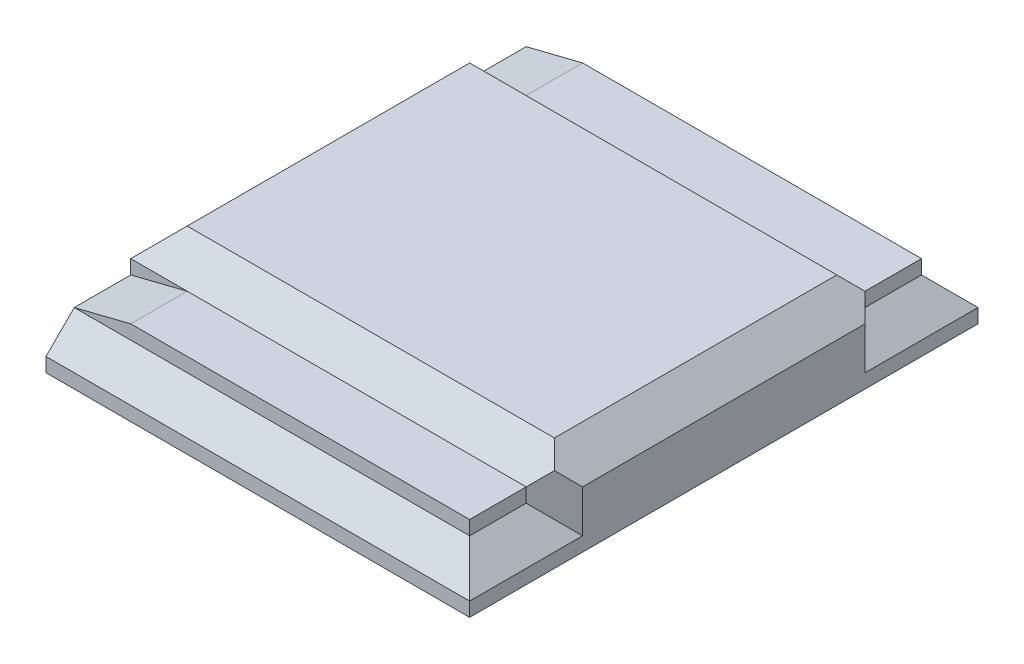
ISO-10303-21;
HEADER;
FILE_DESCRIPTION(('STEP AP214'),'2;1');
FILE_NAME('part.step','',(''),(''),'','','');
FILE_SCHEMA(('AUTOMOTIVE_DESIGN { 1 0 10303 214 1 1 1 1 }'));
ENDSEC;
DATA;
#1=APPLICATION_CONTEXT('core data for automotive mechanical design processes');
#2=APPLICATION_PROTOCOL_DEFINITION('international standard','automotive_design',2000,#1);
#3=PRODUCT_CONTEXT('',#1,'mechanical');
#4=PRODUCT('Part','Part','',(#3));
#5=PRODUCT_RELATED_PRODUCT_CATEGORY('part','',(#4));
#6=PRODUCT_DEFINITION_FORMATION('','',#4);
#7=PRODUCT_DEFINITION_CONTEXT('part definition',#1,'design');
#8=PRODUCT_DEFINITION('design','',#6,#7);
#9=PRODUCT_DEFINITION_SHAPE('','',#8);
#10=(LENGTH_UNIT() NAMED_UNIT(*) SI_UNIT(.MILLI.,.METRE.));
#11=(NAMED_UNIT(*) PLANE_ANGLE_UNIT() SI_UNIT($,.RADIAN.));
#12=(NAMED_UNIT(*) SI_UNIT($,.STERADIAN.) SOLID_ANGLE_UNIT());
#13=UNCERTAINTY_MEASURE_WITH_UNIT(LENGTH_MEASURE(1.E-05),#10,'distance_accuracy_value','');
#14=(GEOMETRIC_REPRESENTATION_CONTEXT(3) GLOBAL_UNCERTAINTY_ASSIGNED_CONTEXT((#13)) GLOBAL_UNIT_ASSIGNED_CONTEXT((#10,
#11,#12)) REPRESENTATION_CONTEXT('',''));
#15=CARTESIAN_POINT('',(0.,0.,0.));
#16=DIRECTION('',(0.,0.,1.));
#17=DIRECTION('',(1.,0.,0.));
#18=AXIS2_PLACEMENT_3D('',#15,#16,#17);
#19=CARTESIAN_POINT('',(9.,3.,6.));
#20=DIRECTION('',(0.,0.,-1.));
#21=DIRECTION('',(-1.,0.,0.));
#22=AXIS2_PLACEMENT_3D('',#19,#20,#21);
#23=PLANE('',#22);
#24=DIRECTION('',(-0.970142500145332,-0.242535625036331,0.));
#25=VECTOR('',#24,1.);
#26=CARTESIAN_POINT('',(-6.,1.5,6.));
#27=LINE('',#26,#25);
#28=CARTESIAN_POINT('',(-4.,2.,6.));
#29=VERTEX_POINT('',#28);
#30=CARTESIAN_POINT('',(-6.,1.5,6.));
#31=VERTEX_POINT('',#30);
#32=EDGE_CURVE('E181',#29,#31,#27,.T.);
#33=ORIENTED_EDGE('',*,*,#32,.F.);
#34=DIRECTION('',(-1.,0.,0.));
#35=VECTOR('',#34,1.);
#36=CARTESIAN_POINT('',(-9.,2.,6.));
#37=LINE('',#36,#35);
#38=CARTESIAN_POINT('',(-6.,2.,6.));
#39=VERTEX_POINT('',#38);
#40=EDGE_CURVE('E284',#29,#39,#37,.T.);
#41=ORIENTED_EDGE('',*,*,#40,.T.);
#42=DIRECTION('',(0.,1.,0.));
#43=VECTOR('',#42,1.);
#44=CARTESIAN_POINT('',(-6.,2.,6.));
#45=LINE('',#44,#43);
#46=EDGE_CURVE('E269',#31,#39,#45,.T.);
#47=ORIENTED_EDGE('',*,*,#46,.F.);
#48=EDGE_LOOP('',(#33,#41,#47));
#49=FACE_BOUND('',#48,.T.);
#50=ADVANCED_FACE('F43',(#49),#23,.F.);
#51=CARTESIAN_POINT('',(9.,3.,-6.));
#52=DIRECTION('',(0.,0.,1.));
#53=DIRECTION('',(1.,0.,0.));
#54=AXIS2_PLACEMENT_3D('',#51,#52,#53);
#55=PLANE('',#54);
#56=DIRECTION('',(0.970142500145332,0.242535625036332,0.));
#57=VECTOR('',#56,1.);
#58=CARTESIAN_POINT('',(-6.,1.5,-6.));
#59=LINE('',#58,#57);
#60=CARTESIAN_POINT('',(-6.,1.5,-6.));
#61=VERTEX_POINT('',#60);
#62=CARTESIAN_POINT('',(-4.,2.,-6.));
#63=VERTEX_POINT('',#62);
#64=EDGE_CURVE('E277',#61,#63,#59,.T.);
#65=ORIENTED_EDGE('',*,*,#64,.F.);
#66=DIRECTION('',(0.,-1.,0.));
#67=VECTOR('',#66,1.);
#68=CARTESIAN_POINT('',(-6.,1.5,-6.));
#69=LINE('',#68,#67);
#70=CARTESIAN_POINT('',(-6.,2.,-6.));
#71=VERTEX_POINT('',#70);
#72=EDGE_CURVE('E242',#71,#61,#69,.T.);
#73=ORIENTED_EDGE('',*,*,#72,.F.);
#74=DIRECTION('',(1.,0.,0.));
#75=VECTOR('',#74,1.);
#76=CARTESIAN_POINT('',(9.,2.,-6.));
#77=LINE('',#76,#75);
#78=EDGE_CURVE('E276',#71,#63,#77,.T.);
#79=ORIENTED_EDGE('',*,*,#78,.T.);
#80=EDGE_LOOP('',(#65,#73,#79));
#81=FACE_BOUND('',#80,.T.);
#82=ADVANCED_FACE('F275',(#81),#55,.F.);
#83=CARTESIAN_POINT('',(-9.,1.5,-9.));
#84=DIRECTION('',(0.,0.,1.));
#85=DIRECTION('',(1.,0.,0.));
#86=AXIS2_PLACEMENT_3D('',#83,#84,#85);
#87=PLANE('',#86);
#88=DIRECTION('',(0.,-1.,0.));
#89=VECTOR('',#88,1.);
#90=CARTESIAN_POINT('',(-6.,0.499999999999996,-9.));
#91=LINE('',#90,#89);
#92=CARTESIAN_POINT('',(-6.,0.499999999999996,-9.));
#93=VERTEX_POINT('',#92);
#94=CARTESIAN_POINT('',(-6.,0.,-9.));
#95=VERTEX_POINT('',#94);
#96=EDGE_CURVE('E394',#93,#95,#91,.T.);
#97=ORIENTED_EDGE('',*,*,#96,.F.);
#98=DIRECTION('',(1.,0.,0.));
#99=VECTOR('',#98,1.);
#100=CARTESIAN_POINT('',(-9.,0.499999999999996,-9.));
#101=LINE('',#100,#99);
#102=CARTESIAN_POINT('',(9.,0.499999999999996,-9.));
#103=VERTEX_POINT('',#102);
#104=EDGE_CURVE('E358',#93,#103,#101,.T.);
#105=ORIENTED_EDGE('',*,*,#104,.T.);
#106=DIRECTION('',(0.,-1.,0.));
#107=VECTOR('',#106,1.);
#108=CARTESIAN_POINT('',(9.,1.5,-9.));
#109=LINE('',#108,#107);
#110=CARTESIAN_POINT('',(9.,0.,-9.));
#111=VERTEX_POINT('',#110);
#112=EDGE_CURVE('E194',#103,#111,#109,.T.);
#113=ORIENTED_EDGE('',*,*,#112,.T.);
#114=DIRECTION('',(-1.,0.,0.));
#115=VECTOR('',#114,1.);
#116=CARTESIAN_POINT('',(-9.,0.,-9.));
#117=LINE('',#116,#115);
#118=EDGE_CURVE('E381',#111,#95,#117,.T.);
#119=ORIENTED_EDGE('',*,*,#118,.T.);
#120=EDGE_LOOP('',(#97,#105,#113,#119));
#121=FACE_BOUND('',#120,.T.);
#122=ADVANCED_FACE('F451',(#121),#87,.F.);
#123=CARTESIAN_POINT('',(-9.,1.5,9.));
#124=DIRECTION('',(0.,0.,-1.));
#125=DIRECTION('',(-1.,0.,0.));
#126=AXIS2_PLACEMENT_3D('',#123,#124,#125);
#127=PLANE('',#126);
#128=DIRECTION('',(0.,1.,0.));
#129=VECTOR('',#128,1.);
#130=CARTESIAN_POINT('',(-6.,0.,9.));
#131=LINE('',#130,#129);
#132=CARTESIAN_POINT('',(-6.,0.,9.));
#133=VERTEX_POINT('',#132);
#134=CARTESIAN_POINT('',(-6.,0.499999999999996,9.));
#135=VERTEX_POINT('',#134);
#136=EDGE_CURVE('E370',#133,#135,#131,.T.);
#137=ORIENTED_EDGE('',*,*,#136,.F.);
#138=DIRECTION('',(1.,0.,0.));
#139=VECTOR('',#138,1.);
#140=CARTESIAN_POINT('',(-9.,0.,9.));
#141=LINE('',#140,#139);
#142=CARTESIAN_POINT('',(9.,0.,9.));
#143=VERTEX_POINT('',#142);
#144=EDGE_CURVE('E374',#133,#143,#141,.T.);
#145=ORIENTED_EDGE('',*,*,#144,.T.);
#146=DIRECTION('',(0.,-1.,0.));
#147=VECTOR('',#146,1.);
#148=CARTESIAN_POINT('',(9.,1.5,9.));
#149=LINE('',#148,#147);
#150=CARTESIAN_POINT('',(9.,0.499999999999996,9.));
#151=VERTEX_POINT('',#150);
#152=EDGE_CURVE('E373',#151,#143,#149,.T.);
#153=ORIENTED_EDGE('',*,*,#152,.F.);
#154=DIRECTION('',(-1.,0.,0.));
#155=VECTOR('',#154,1.);
#156=CARTESIAN_POINT('',(-9.,0.499999999999996,9.));
#157=LINE('',#156,#155);
#158=EDGE_CURVE('E201',#151,#135,#157,.T.);
#159=ORIENTED_EDGE('',*,*,#158,.T.);
#160=EDGE_LOOP('',(#137,#145,#153,#159));
#161=FACE_BOUND('',#160,.T.);
#162=ADVANCED_FACE('F369',(#161),#127,.F.);
#163=CARTESIAN_POINT('',(0.,0.,0.));
#164=DIRECTION('',(0.,-1.,0.));
#165=DIRECTION('',(0.,0.,-1.));
#166=AXIS2_PLACEMENT_3D('',#163,#164,#165);
#167=PLANE('',#166);
#168=ORIENTED_EDGE('',*,*,#144,.F.);
#169=DIRECTION('',(0.,0.,1.));
#170=VECTOR('',#169,1.);
#171=CARTESIAN_POINT('',(-6.,0.,-9.));
#172=LINE('',#171,#170);
#173=EDGE_CURVE('E391',#95,#133,#172,.T.);
#174=ORIENTED_EDGE('',*,*,#173,.F.);
#175=ORIENTED_EDGE('',*,*,#118,.F.);
#176=DIRECTION('',(0.,0.,-1.));
#177=VECTOR('',#176,1.);
#178=CARTESIAN_POINT('',(9.,0.,9.));
#179=LINE('',#178,#177);
#180=EDGE_CURVE('E254',#143,#111,#179,.T.);
#181=ORIENTED_EDGE('',*,*,#180,.F.);
#182=EDGE_LOOP('',(#168,#174,#175,#181));
#183=FACE_BOUND('',#182,.T.);
#184=ADVANCED_FACE('F449',(#183),#167,.T.);
#185=CARTESIAN_POINT('',(0.,1.5,-8.));
#186=DIRECTION('',(0.,-0.707106781186546,0.707106781186549));
#187=DIRECTION('',(-1.,0.,0.));
#188=AXIS2_PLACEMENT_3D('',#185,#186,#187);
#189=PLANE('',#188);
#190=ORIENTED_EDGE('',*,*,#104,.F.);
#191=DIRECTION('',(0.,-0.707106781186549,-0.707106781186546));
#192=VECTOR('',#191,1.);
#193=CARTESIAN_POINT('',(-6.,1.5,-8.));
#194=LINE('',#193,#192);
#195=CARTESIAN_POINT('',(-6.,1.5,-8.));
#196=VERTEX_POINT('',#195);
#197=EDGE_CURVE('E354',#196,#93,#194,.T.);
#198=ORIENTED_EDGE('',*,*,#197,.F.);
#199=DIRECTION('',(-1.,0.,0.));
#200=VECTOR('',#199,1.);
#201=CARTESIAN_POINT('',(0.,1.5,-8.));
#202=LINE('',#201,#200);
#203=CARTESIAN_POINT('',(8.,1.5,-8.));
#204=VERTEX_POINT('',#203);
#205=EDGE_CURVE('E193',#204,#196,#202,.T.);
#206=ORIENTED_EDGE('',*,*,#205,.F.);
#207=DIRECTION('',(0.577350269189625,-0.577350269189627,-0.577350269189625));
#208=VECTOR('',#207,1.);
#209=CARTESIAN_POINT('',(5.33333333333334,4.16666666666667,-5.33333333333334));
#210=LINE('',#209,#208);
#211=EDGE_CURVE('E231',#204,#103,#210,.T.);
#212=ORIENTED_EDGE('',*,*,#211,.T.);
#213=EDGE_LOOP('',(#190,#198,#206,#212));
#214=FACE_BOUND('',#213,.T.);
#215=ADVANCED_FACE('F353',(#214),#189,.F.);
#216=CARTESIAN_POINT('',(0.,1.5,8.));
#217=DIRECTION('',(0.,-0.707106781186546,-0.707106781186549));
#218=DIRECTION('',(1.,0.,0.));
#219=AXIS2_PLACEMENT_3D('',#216,#217,#218);
#220=PLANE('',#219);
#221=DIRECTION('',(1.,0.,0.));
#222=VECTOR('',#221,1.);
#223=CARTESIAN_POINT('',(0.,1.5,8.));
#224=LINE('',#223,#222);
#225=CARTESIAN_POINT('',(-6.,1.5,8.));
#226=VERTEX_POINT('',#225);
#227=CARTESIAN_POINT('',(8.,1.5,8.));
#228=VERTEX_POINT('',#227);
#229=EDGE_CURVE('E184',#226,#228,#224,.T.);
#230=ORIENTED_EDGE('',*,*,#229,.F.);
#231=DIRECTION('',(0.,0.707106781186549,-0.707106781186546));
#232=VECTOR('',#231,1.);
#233=CARTESIAN_POINT('',(-6.,0.499999999999996,9.));
#234=LINE('',#233,#232);
#235=EDGE_CURVE('E403',#135,#226,#234,.T.);
#236=ORIENTED_EDGE('',*,*,#235,.F.);
#237=ORIENTED_EDGE('',*,*,#158,.F.);
#238=DIRECTION('',(-0.577350269189625,0.577350269189627,-0.577350269189625));
#239=VECTOR('',#238,1.);
#240=CARTESIAN_POINT('',(5.33333333333334,4.16666666666667,5.33333333333334));
#241=LINE('',#240,#239);
#242=EDGE_CURVE('E198',#151,#228,#241,.T.);
#243=ORIENTED_EDGE('',*,*,#242,.T.);
#244=EDGE_LOOP('',(#230,#236,#237,#243));
#245=FACE_BOUND('',#244,.T.);
#246=ADVANCED_FACE('F199',(#245),#220,.F.);
#247=CARTESIAN_POINT('',(9.,1.5,9.));
#248=DIRECTION('',(-1.,0.,0.));
#249=DIRECTION('',(0.,0.,1.));
#250=AXIS2_PLACEMENT_3D('',#247,#248,#249);
#251=PLANE('',#250);
#252=DIRECTION('',(0.,-1.,0.));
#253=VECTOR('',#252,1.);
#254=CARTESIAN_POINT('',(9.,1.5,5.));
#255=LINE('',#254,#253);
#256=CARTESIAN_POINT('',(9.,2.,5.));
#257=VERTEX_POINT('',#256);
#258=CARTESIAN_POINT('',(9.,0.499999999999996,5.));
#259=VERTEX_POINT('',#258);
#260=EDGE_CURVE('E302',#257,#259,#255,.T.);
#261=ORIENTED_EDGE('',*,*,#260,.T.);
#262=DIRECTION('',(0.,0.,1.));
#263=VECTOR('',#262,1.);
#264=CARTESIAN_POINT('',(9.,0.499999999999996,9.));
#265=LINE('',#264,#263);
#266=EDGE_CURVE('E309',#259,#151,#265,.T.);
#267=ORIENTED_EDGE('',*,*,#266,.T.);
#268=ORIENTED_EDGE('',*,*,#152,.T.);
#269=ORIENTED_EDGE('',*,*,#180,.T.);
#270=ORIENTED_EDGE('',*,*,#112,.F.);
#271=DIRECTION('',(0.,0.,1.));
#272=VECTOR('',#271,1.);
#273=CARTESIAN_POINT('',(9.,0.499999999999996,9.));
#274=LINE('',#273,#272);
#275=CARTESIAN_POINT('',(9.,0.499999999999996,-5.));
#276=VERTEX_POINT('',#275);
#277=EDGE_CURVE('E306',#103,#276,#274,.T.);
#278=ORIENTED_EDGE('',*,*,#277,.T.);
#279=DIRECTION('',(0.,1.,0.));
#280=VECTOR('',#279,1.);
#281=CARTESIAN_POINT('',(9.,1.5,-5.));
#282=LINE('',#281,#280);
#283=CARTESIAN_POINT('',(9.,2.,-5.));
#284=VERTEX_POINT('',#283);
#285=EDGE_CURVE('E299',#276,#284,#282,.T.);
#286=ORIENTED_EDGE('',*,*,#285,.T.);
#287=DIRECTION('',(0.,0.,1.));
#288=VECTOR('',#287,1.);
#289=CARTESIAN_POINT('',(9.,2.,5.));
#290=LINE('',#289,#288);
#291=EDGE_CURVE('E296',#284,#257,#290,.T.);
#292=ORIENTED_EDGE('',*,*,#291,.T.);
#293=EDGE_LOOP('',(#261,#267,#268,#269,#270,#278,#286,#292));
#294=FACE_BOUND('',#293,.T.);
#295=ADVANCED_FACE('F336',(#294),#251,.F.);
#296=CARTESIAN_POINT('',(0.,3.,0.));
#297=DIRECTION('',(0.,1.,0.));
#298=DIRECTION('',(0.,0.,1.));
#299=AXIS2_PLACEMENT_3D('',#296,#297,#298);
#300=PLANE('',#299);
#301=DIRECTION('',(-1.,0.,0.));
#302=VECTOR('',#301,1.);
#303=CARTESIAN_POINT('',(-9.,3.,-5.));
#304=LINE('',#303,#302);
#305=CARTESIAN_POINT('',(8.,3.,-5.));
#306=VERTEX_POINT('',#305);
#307=CARTESIAN_POINT('',(-4.99999999999999,3.,-5.));
#308=VERTEX_POINT('',#307);
#309=EDGE_CURVE('E285',#306,#308,#304,.T.);
#310=ORIENTED_EDGE('',*,*,#309,.T.);
#311=DIRECTION('',(0.,0.,1.));
#312=VECTOR('',#311,1.);
#313=CARTESIAN_POINT('',(-4.99999999999999,3.,5.));
#314=LINE('',#313,#312);
#315=CARTESIAN_POINT('',(-4.99999999999999,3.,5.));
#316=VERTEX_POINT('',#315);
#317=EDGE_CURVE('E53',#308,#316,#314,.T.);
#318=ORIENTED_EDGE('',*,*,#317,.T.);
#319=DIRECTION('',(1.,0.,0.));
#320=VECTOR('',#319,1.);
#321=CARTESIAN_POINT('',(9.,3.,5.));
#322=LINE('',#321,#320);
#323=CARTESIAN_POINT('',(8.,3.,5.));
#324=VERTEX_POINT('',#323);
#325=EDGE_CURVE('E291',#316,#324,#322,.T.);
#326=ORIENTED_EDGE('',*,*,#325,.T.);
#327=DIRECTION('',(0.,0.,-1.));
#328=VECTOR('',#327,1.);
#329=CARTESIAN_POINT('',(8.,3.,-5.));
#330=LINE('',#329,#328);
#331=EDGE_CURVE('E235',#324,#306,#330,.T.);
#332=ORIENTED_EDGE('',*,*,#331,.T.);
#333=EDGE_LOOP('',(#310,#318,#326,#332));
#334=FACE_BOUND('',#333,.T.);
#335=ADVANCED_FACE('F326',(#334),#300,.T.);
#336=CARTESIAN_POINT('',(0.,3.,-5.));
#337=DIRECTION('',(0.,0.707106781186546,-0.707106781186549));
#338=DIRECTION('',(1.,0.,0.));
#339=AXIS2_PLACEMENT_3D('',#336,#337,#338);
#340=PLANE('',#339);
#341=ORIENTED_EDGE('',*,*,#78,.F.);
#342=DIRECTION('',(0.577350269189628,0.577350269189626,0.577350269189624));
#343=VECTOR('',#342,1.);
#344=CARTESIAN_POINT('',(-3.33333333333332,4.66666666666667,-3.33333333333333));
#345=LINE('',#344,#343);
#346=EDGE_CURVE('E67',#71,#308,#345,.T.);
#347=ORIENTED_EDGE('',*,*,#346,.T.);
#348=ORIENTED_EDGE('',*,*,#309,.F.);
#349=DIRECTION('',(0.577350269189625,-0.577350269189627,-0.577350269189625));
#350=VECTOR('',#349,1.);
#351=CARTESIAN_POINT('',(5.33333333333334,5.66666666666667,-2.33333333333334));
#352=LINE('',#351,#350);
#353=CARTESIAN_POINT('',(8.5,2.5,-5.5));
#354=VERTEX_POINT('',#353);
#355=EDGE_CURVE('E220',#306,#354,#352,.T.);
#356=ORIENTED_EDGE('',*,*,#355,.T.);
#357=DIRECTION('',(0.577350269189624,0.577350269189628,0.577350269189626));
#358=VECTOR('',#357,1.);
#359=CARTESIAN_POINT('',(6.00000000000002,0.,-7.99999999999999));
#360=LINE('',#359,#358);
#361=CARTESIAN_POINT('',(8.,2.,-6.));
#362=VERTEX_POINT('',#361);
#363=EDGE_CURVE('E223',#354,#362,#360,.F.);
#364=ORIENTED_EDGE('',*,*,#363,.T.);
#365=DIRECTION('',(1.,0.,0.));
#366=VECTOR('',#365,1.);
#367=CARTESIAN_POINT('',(-4.,2.,-6.));
#368=LINE('',#367,#366);
#369=EDGE_CURVE('E282',#63,#362,#368,.T.);
#370=ORIENTED_EDGE('',*,*,#369,.F.);
#371=EDGE_LOOP('',(#341,#347,#348,#356,#364,#370));
#372=FACE_BOUND('',#371,.T.);
#373=ADVANCED_FACE('F281',(#372),#340,.T.);
#374=CARTESIAN_POINT('',(0.,3.,5.));
#375=DIRECTION('',(0.,0.707106781186546,0.707106781186549));
#376=DIRECTION('',(-1.,0.,0.));
#377=AXIS2_PLACEMENT_3D('',#374,#375,#376);
#378=PLANE('',#377);
#379=ORIENTED_EDGE('',*,*,#325,.F.);
#380=DIRECTION('',(-0.577350269189628,-0.577350269189626,0.577350269189624));
#381=VECTOR('',#380,1.);
#382=CARTESIAN_POINT('',(-3.33333333333332,4.66666666666667,3.33333333333333));
#383=LINE('',#382,#381);
#384=EDGE_CURVE('E11',#316,#39,#383,.T.);
#385=ORIENTED_EDGE('',*,*,#384,.T.);
#386=ORIENTED_EDGE('',*,*,#40,.F.);
#387=CARTESIAN_POINT('',(8.,2.,6.));
#388=VERTEX_POINT('',#387);
#389=EDGE_CURVE('E289',#388,#29,#37,.T.);
#390=ORIENTED_EDGE('',*,*,#389,.F.);
#391=DIRECTION('',(-0.577350269189624,-0.577350269189628,0.577350269189626));
#392=VECTOR('',#391,1.);
#393=CARTESIAN_POINT('',(6.00000000000002,0.,7.99999999999999));
#394=LINE('',#393,#392);
#395=CARTESIAN_POINT('',(8.5,2.5,5.5));
#396=VERTEX_POINT('',#395);
#397=EDGE_CURVE('E211',#388,#396,#394,.F.);
#398=ORIENTED_EDGE('',*,*,#397,.T.);
#399=DIRECTION('',(-0.577350269189625,0.577350269189627,-0.577350269189625));
#400=VECTOR('',#399,1.);
#401=CARTESIAN_POINT('',(5.33333333333334,5.66666666666667,2.33333333333334));
#402=LINE('',#401,#400);
#403=EDGE_CURVE('E214',#396,#324,#402,.T.);
#404=ORIENTED_EDGE('',*,*,#403,.T.);
#405=EDGE_LOOP('',(#379,#385,#386,#390,#398,#404));
#406=FACE_BOUND('',#405,.T.);
#407=ADVANCED_FACE('F319',(#406),#378,.T.);
#408=CARTESIAN_POINT('',(8.,1.5,0.));
#409=DIRECTION('',(-0.707106781186549,-0.707106781186546,0.));
#410=DIRECTION('',(0.,0.,-1.));
#411=AXIS2_PLACEMENT_3D('',#408,#409,#410);
#412=PLANE('',#411);
#413=ORIENTED_EDGE('',*,*,#211,.F.);
#414=DIRECTION('',(0.,0.,-1.));
#415=VECTOR('',#414,1.);
#416=CARTESIAN_POINT('',(8.,1.5,0.));
#417=LINE('',#416,#415);
#418=CARTESIAN_POINT('',(8.,1.5,-6.));
#419=VERTEX_POINT('',#418);
#420=EDGE_CURVE('E227',#419,#204,#417,.T.);
#421=ORIENTED_EDGE('',*,*,#420,.F.);
#422=DIRECTION('',(0.577350269189624,-0.577350269189626,0.577350269189626));
#423=VECTOR('',#422,1.);
#424=CARTESIAN_POINT('',(7.5,2.,-6.5));
#425=LINE('',#424,#423);
#426=EDGE_CURVE('E250',#276,#419,#425,.F.);
#427=ORIENTED_EDGE('',*,*,#426,.F.);
#428=ORIENTED_EDGE('',*,*,#277,.F.);
#429=EDGE_LOOP('',(#413,#421,#427,#428));
#430=FACE_BOUND('',#429,.T.);
#431=ADVANCED_FACE('F343',(#430),#412,.F.);
#432=CARTESIAN_POINT('',(8.,3.,-6.));
#433=DIRECTION('',(-0.707106781186549,0.,0.707106781186546));
#434=DIRECTION('',(0.,-1.,0.));
#435=AXIS2_PLACEMENT_3D('',#432,#433,#434);
#436=PLANE('',#435);
#437=DIRECTION('',(0.,-1.,0.));
#438=VECTOR('',#437,1.);
#439=CARTESIAN_POINT('',(8.,3.,-6.));
#440=LINE('',#439,#438);
#441=EDGE_CURVE('E205',#362,#419,#440,.T.);
#442=ORIENTED_EDGE('',*,*,#441,.F.);
#443=ORIENTED_EDGE('',*,*,#363,.F.);
#444=DIRECTION('',(0.577350269189624,-0.577350269189626,0.577350269189626));
#445=VECTOR('',#444,1.);
#446=CARTESIAN_POINT('',(9.99999999999999,0.999999999999996,-3.99999999999999));
#447=LINE('',#446,#445);
#448=EDGE_CURVE('E246',#284,#354,#447,.F.);
#449=ORIENTED_EDGE('',*,*,#448,.F.);
#450=ORIENTED_EDGE('',*,*,#285,.F.);
#451=ORIENTED_EDGE('',*,*,#426,.T.);
#452=EDGE_LOOP('',(#442,#443,#449,#450,#451));
#453=FACE_BOUND('',#452,.T.);
#454=ADVANCED_FACE('F331',(#453),#436,.F.);
#455=CARTESIAN_POINT('',(8.,3.,0.));
#456=DIRECTION('',(0.707106781186549,0.707106781186546,0.));
#457=DIRECTION('',(0.,0.,1.));
#458=AXIS2_PLACEMENT_3D('',#455,#456,#457);
#459=PLANE('',#458);
#460=ORIENTED_EDGE('',*,*,#331,.F.);
#461=ORIENTED_EDGE('',*,*,#403,.F.);
#462=DIRECTION('',(0.577350269189624,-0.577350269189626,-0.577350269189626));
#463=VECTOR('',#462,1.);
#464=CARTESIAN_POINT('',(9.16666666666666,1.83333333333333,4.83333333333333));
#465=LINE('',#464,#463);
#466=EDGE_CURVE('E241',#257,#396,#465,.F.);
#467=ORIENTED_EDGE('',*,*,#466,.F.);
#468=ORIENTED_EDGE('',*,*,#291,.F.);
#469=ORIENTED_EDGE('',*,*,#448,.T.);
#470=ORIENTED_EDGE('',*,*,#355,.F.);
#471=EDGE_LOOP('',(#460,#461,#467,#468,#469,#470));
#472=FACE_BOUND('',#471,.T.);
#473=ADVANCED_FACE('F325',(#472),#459,.T.);
#474=CARTESIAN_POINT('',(8.,1.5,0.));
#475=DIRECTION('',(-0.707106781186549,-0.707106781186546,0.));
#476=DIRECTION('',(0.,0.,-1.));
#477=AXIS2_PLACEMENT_3D('',#474,#475,#476);
#478=PLANE('',#477);
#479=ORIENTED_EDGE('',*,*,#242,.F.);
#480=ORIENTED_EDGE('',*,*,#266,.F.);
#481=DIRECTION('',(-0.577350269189624,0.577350269189626,0.577350269189626));
#482=VECTOR('',#481,1.);
#483=CARTESIAN_POINT('',(8.66666666666666,0.833333333333331,5.33333333333333));
#484=LINE('',#483,#482);
#485=CARTESIAN_POINT('',(8.,1.5,6.));
#486=VERTEX_POINT('',#485);
#487=EDGE_CURVE('E209',#486,#259,#484,.F.);
#488=ORIENTED_EDGE('',*,*,#487,.F.);
#489=DIRECTION('',(0.,0.,-1.));
#490=VECTOR('',#489,1.);
#491=CARTESIAN_POINT('',(8.,1.5,0.));
#492=LINE('',#491,#490);
#493=EDGE_CURVE('E173',#228,#486,#492,.T.);
#494=ORIENTED_EDGE('',*,*,#493,.F.);
#495=EDGE_LOOP('',(#479,#480,#488,#494));
#496=FACE_BOUND('',#495,.T.);
#497=ADVANCED_FACE('F208',(#496),#478,.F.);
#498=CARTESIAN_POINT('',(9.,1.5,5.));
#499=DIRECTION('',(-0.707106781186549,0.,-0.707106781186546));
#500=DIRECTION('',(0.,-1.,0.));
#501=AXIS2_PLACEMENT_3D('',#498,#499,#500);
#502=PLANE('',#501);
#503=ORIENTED_EDGE('',*,*,#397,.F.);
#504=DIRECTION('',(0.,1.,0.));
#505=VECTOR('',#504,1.);
#506=CARTESIAN_POINT('',(8.,3.,6.));
#507=LINE('',#506,#505);
#508=EDGE_CURVE('E312',#486,#388,#507,.T.);
#509=ORIENTED_EDGE('',*,*,#508,.F.);
#510=ORIENTED_EDGE('',*,*,#487,.T.);
#511=ORIENTED_EDGE('',*,*,#260,.F.);
#512=ORIENTED_EDGE('',*,*,#466,.T.);
#513=EDGE_LOOP('',(#503,#509,#510,#511,#512));
#514=FACE_BOUND('',#513,.T.);
#515=ADVANCED_FACE('F496',(#514),#502,.F.);
#516=CARTESIAN_POINT('',(-6.,0.,0.));
#517=DIRECTION('',(1.,0.,0.));
#518=DIRECTION('',(0.,0.,-1.));
#519=AXIS2_PLACEMENT_3D('',#516,#517,#518);
#520=PLANE('',#519);
#521=ORIENTED_EDGE('',*,*,#46,.T.);
#522=DIRECTION('',(0.,0.,-1.));
#523=VECTOR('',#522,1.);
#524=CARTESIAN_POINT('',(-6.,2.,-5.));
#525=LINE('',#524,#523);
#526=EDGE_CURVE('E238',#39,#71,#525,.T.);
#527=ORIENTED_EDGE('',*,*,#526,.T.);
#528=ORIENTED_EDGE('',*,*,#72,.T.);
#529=DIRECTION('',(0.,0.,-1.));
#530=VECTOR('',#529,1.);
#531=CARTESIAN_POINT('',(-6.,1.5,8.));
#532=LINE('',#531,#530);
#533=EDGE_CURVE('E402',#61,#196,#532,.T.);
#534=ORIENTED_EDGE('',*,*,#533,.T.);
#535=ORIENTED_EDGE('',*,*,#197,.T.);
#536=ORIENTED_EDGE('',*,*,#96,.T.);
#537=ORIENTED_EDGE('',*,*,#173,.T.);
#538=ORIENTED_EDGE('',*,*,#136,.T.);
#539=ORIENTED_EDGE('',*,*,#235,.T.);
#540=EDGE_CURVE('E399',#226,#31,#532,.T.);
#541=ORIENTED_EDGE('',*,*,#540,.T.);
#542=EDGE_LOOP('',(#521,#527,#528,#534,#535,#536,#537,#538,#539,#541));
#543=FACE_BOUND('',#542,.T.);
#544=ADVANCED_FACE('F265',(#543),#520,.F.);
#545=CARTESIAN_POINT('',(-6.,2.,0.));
#546=DIRECTION('',(-0.707106781186546,0.707106781186549,0.));
#547=DIRECTION('',(0.,0.,1.));
#548=AXIS2_PLACEMENT_3D('',#545,#546,#547);
#549=PLANE('',#548);
#550=ORIENTED_EDGE('',*,*,#384,.F.);
#551=ORIENTED_EDGE('',*,*,#317,.F.);
#552=ORIENTED_EDGE('',*,*,#346,.F.);
#553=ORIENTED_EDGE('',*,*,#526,.F.);
#554=EDGE_LOOP('',(#550,#551,#552,#553));
#555=FACE_BOUND('',#554,.T.);
#556=ADVANCED_FACE('F46',(#555),#549,.T.);
#557=CARTESIAN_POINT('',(-6.,1.5,-8.));
#558=DIRECTION('',(0.242535625036332,-0.970142500145332,0.));
#559=DIRECTION('',(0.970142500145332,0.242535625036332,0.));
#560=AXIS2_PLACEMENT_3D('',#557,#558,#559);
#561=PLANE('',#560);
#562=ORIENTED_EDGE('',*,*,#64,.T.);
#563=DIRECTION('',(0.,0.,1.));
#564=VECTOR('',#563,1.);
#565=CARTESIAN_POINT('',(-4.,2.,-8.));
#566=LINE('',#565,#564);
#567=CARTESIAN_POINT('',(-4.,2.,-8.));
#568=VERTEX_POINT('',#567);
#569=EDGE_CURVE('E409',#568,#63,#566,.T.);
#570=ORIENTED_EDGE('',*,*,#569,.F.);
#571=DIRECTION('',(0.970142500145332,0.242535625036332,0.));
#572=VECTOR('',#571,1.);
#573=CARTESIAN_POINT('',(-6.,1.5,-8.));
#574=LINE('',#573,#572);
#575=EDGE_CURVE('E418',#196,#568,#574,.T.);
#576=ORIENTED_EDGE('',*,*,#575,.F.);
#577=ORIENTED_EDGE('',*,*,#533,.F.);
#578=EDGE_LOOP('',(#562,#570,#576,#577));
#579=FACE_BOUND('',#578,.T.);
#580=ADVANCED_FACE('F545',(#579),#561,.F.);
#581=CARTESIAN_POINT('',(-4.,2.,-8.));
#582=DIRECTION('',(0.,-1.,0.));
#583=DIRECTION('',(0.,0.,-1.));
#584=AXIS2_PLACEMENT_3D('',#581,#582,#583);
#585=PLANE('',#584);
#586=ORIENTED_EDGE('',*,*,#369,.T.);
#587=DIRECTION('',(0.,0.,1.));
#588=VECTOR('',#587,1.);
#589=CARTESIAN_POINT('',(8.,2.,-8.));
#590=LINE('',#589,#588);
#591=CARTESIAN_POINT('',(8.,2.,-8.));
#592=VERTEX_POINT('',#591);
#593=EDGE_CURVE('E413',#592,#362,#590,.T.);
#594=ORIENTED_EDGE('',*,*,#593,.F.);
#595=DIRECTION('',(1.,0.,0.));
#596=VECTOR('',#595,1.);
#597=CARTESIAN_POINT('',(-4.,2.,-8.));
#598=LINE('',#597,#596);
#599=EDGE_CURVE('E423',#568,#592,#598,.T.);
#600=ORIENTED_EDGE('',*,*,#599,.F.);
#601=ORIENTED_EDGE('',*,*,#569,.T.);
#602=EDGE_LOOP('',(#586,#594,#600,#601));
#603=FACE_BOUND('',#602,.T.);
#604=ADVANCED_FACE('F550',(#603),#585,.F.);
#605=CARTESIAN_POINT('',(8.,2.,-8.));
#606=DIRECTION('',(-1.,0.,0.));
#607=DIRECTION('',(0.,0.,1.));
#608=AXIS2_PLACEMENT_3D('',#605,#606,#607);
#609=PLANE('',#608);
#610=ORIENTED_EDGE('',*,*,#441,.T.);
#611=ORIENTED_EDGE('',*,*,#420,.T.);
#612=DIRECTION('',(0.,-1.,0.));
#613=VECTOR('',#612,1.);
#614=CARTESIAN_POINT('',(8.,2.,-8.));
#615=LINE('',#614,#613);
#616=EDGE_CURVE('E349',#592,#204,#615,.T.);
#617=ORIENTED_EDGE('',*,*,#616,.F.);
#618=ORIENTED_EDGE('',*,*,#593,.T.);
#619=EDGE_LOOP('',(#610,#611,#617,#618));
#620=FACE_BOUND('',#619,.T.);
#621=ADVANCED_FACE('F347',(#620),#609,.F.);
#622=CARTESIAN_POINT('',(0.,0.,-8.));
#623=DIRECTION('',(0.,0.,1.));
#624=DIRECTION('',(1.,0.,0.));
#625=AXIS2_PLACEMENT_3D('',#622,#623,#624);
#626=PLANE('',#625);
#627=ORIENTED_EDGE('',*,*,#205,.T.);
#628=ORIENTED_EDGE('',*,*,#575,.T.);
#629=ORIENTED_EDGE('',*,*,#599,.T.);
#630=ORIENTED_EDGE('',*,*,#616,.T.);
#631=EDGE_LOOP('',(#627,#628,#629,#630));
#632=FACE_BOUND('',#631,.T.);
#633=ADVANCED_FACE('F563',(#632),#626,.F.);
#634=CARTESIAN_POINT('',(8.,2.,8.));
#635=DIRECTION('',(-1.,0.,0.));
#636=DIRECTION('',(0.,0.,1.));
#637=AXIS2_PLACEMENT_3D('',#634,#635,#636);
#638=PLANE('',#637);
#639=ORIENTED_EDGE('',*,*,#508,.T.);
#640=DIRECTION('',(0.,0.,-1.));
#641=VECTOR('',#640,1.);
#642=CARTESIAN_POINT('',(8.,2.,8.));
#643=LINE('',#642,#641);
#644=CARTESIAN_POINT('',(8.,2.,8.));
#645=VERTEX_POINT('',#644);
#646=EDGE_CURVE('E176',#645,#388,#643,.T.);
#647=ORIENTED_EDGE('',*,*,#646,.F.);
#648=DIRECTION('',(0.,1.,0.));
#649=VECTOR('',#648,1.);
#650=CARTESIAN_POINT('',(8.,2.,8.));
#651=LINE('',#650,#649);
#652=EDGE_CURVE('E169',#228,#645,#651,.T.);
#653=ORIENTED_EDGE('',*,*,#652,.F.);
#654=ORIENTED_EDGE('',*,*,#493,.T.);
#655=EDGE_LOOP('',(#639,#647,#653,#654));
#656=FACE_BOUND('',#655,.T.);
#657=ADVANCED_FACE('F171',(#656),#638,.F.);
#658=CARTESIAN_POINT('',(-4.,2.,8.));
#659=DIRECTION('',(0.,-1.,0.));
#660=DIRECTION('',(0.,0.,-1.));
#661=AXIS2_PLACEMENT_3D('',#658,#659,#660);
#662=PLANE('',#661);
#663=ORIENTED_EDGE('',*,*,#389,.T.);
#664=DIRECTION('',(0.,0.,-1.));
#665=VECTOR('',#664,1.);
#666=CARTESIAN_POINT('',(-4.,2.,8.));
#667=LINE('',#666,#665);
#668=CARTESIAN_POINT('',(-4.,2.,8.));
#669=VERTEX_POINT('',#668);
#670=EDGE_CURVE('E430',#669,#29,#667,.T.);
#671=ORIENTED_EDGE('',*,*,#670,.F.);
#672=DIRECTION('',(-1.,0.,0.));
#673=VECTOR('',#672,1.);
#674=CARTESIAN_POINT('',(-4.,2.,8.));
#675=LINE('',#674,#673);
#676=EDGE_CURVE('E180',#645,#669,#675,.T.);
#677=ORIENTED_EDGE('',*,*,#676,.F.);
#678=ORIENTED_EDGE('',*,*,#646,.T.);
#679=EDGE_LOOP('',(#663,#671,#677,#678));
#680=FACE_BOUND('',#679,.T.);
#681=ADVANCED_FACE('F441',(#680),#662,.F.);
#682=CARTESIAN_POINT('',(-6.,1.5,8.));
#683=DIRECTION('',(0.242535625036331,-0.970142500145332,0.));
#684=DIRECTION('',(0.970142500145332,0.242535625036331,0.));
#685=AXIS2_PLACEMENT_3D('',#682,#683,#684);
#686=PLANE('',#685);
#687=ORIENTED_EDGE('',*,*,#32,.T.);
#688=ORIENTED_EDGE('',*,*,#540,.F.);
#689=DIRECTION('',(-0.970142500145332,-0.242535625036331,0.));
#690=VECTOR('',#689,1.);
#691=CARTESIAN_POINT('',(-6.,1.5,8.));
#692=LINE('',#691,#690);
#693=EDGE_CURVE('E188',#669,#226,#692,.T.);
#694=ORIENTED_EDGE('',*,*,#693,.F.);
#695=ORIENTED_EDGE('',*,*,#670,.T.);
#696=EDGE_LOOP('',(#687,#688,#694,#695));
#697=FACE_BOUND('',#696,.T.);
#698=ADVANCED_FACE('F444',(#697),#686,.F.);
#699=CARTESIAN_POINT('',(0.,0.,8.));
#700=DIRECTION('',(0.,0.,1.));
#701=DIRECTION('',(1.,0.,0.));
#702=AXIS2_PLACEMENT_3D('',#699,#700,#701);
#703=PLANE('',#702);
#704=ORIENTED_EDGE('',*,*,#229,.T.);
#705=ORIENTED_EDGE('',*,*,#652,.T.);
#706=ORIENTED_EDGE('',*,*,#676,.T.);
#707=ORIENTED_EDGE('',*,*,#693,.T.);
#708=EDGE_LOOP('',(#704,#705,#706,#707));
#709=FACE_BOUND('',#708,.T.);
#710=ADVANCED_FACE('F186',(#709),#703,.T.);
#711=CLOSED_SHELL('',(#50,#82,#122,#162,#184,#215,#246,#295,#335,#373,#407,#431,#454,#473,#497,
#515,#544,#556,#580,#604,#621,#633,#657,#681,#698,#710));
#712=MANIFOLD_SOLID_BREP('B2',#711);
#713=ADVANCED_BREP_SHAPE_REPRESENTATION('',(#18,#712),#14);
#714=SHAPE_DEFINITION_REPRESENTATION(#9,#713);
ENDSEC;
END-ISO-10303-21;
